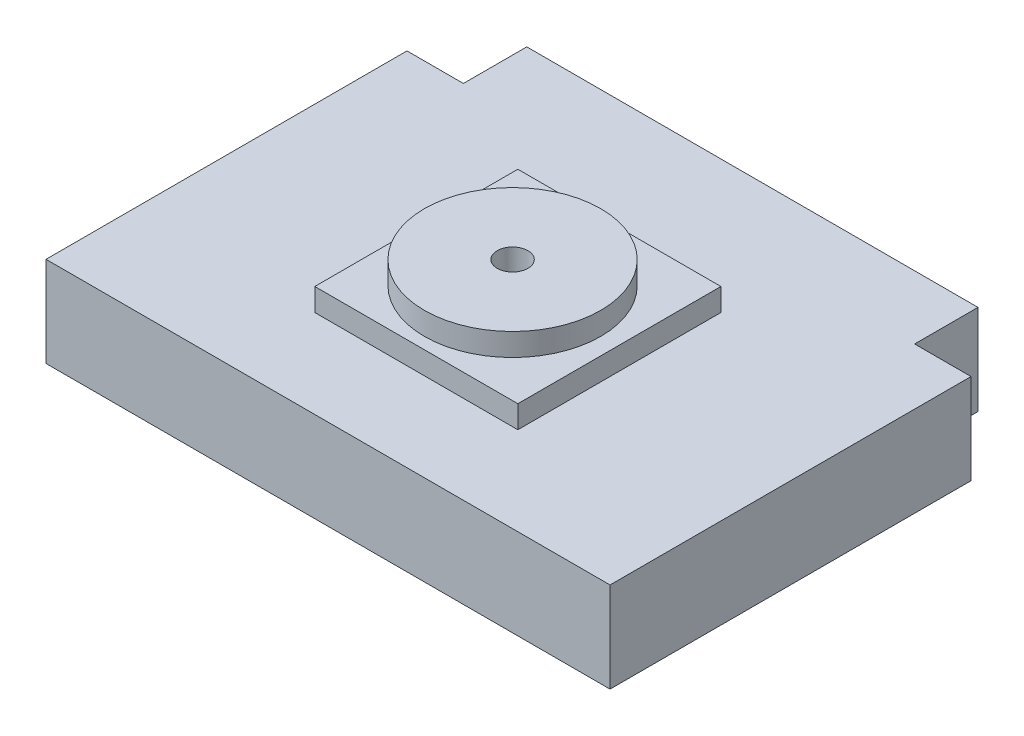
ISO-10303-21;
HEADER;
FILE_DESCRIPTION(('STEP AP214'),'2;1');
FILE_NAME('part.step','',(''),(''),'','','');
FILE_SCHEMA(('AUTOMOTIVE_DESIGN { 1 0 10303 214 1 1 1 1 }'));
ENDSEC;
DATA;
#1=APPLICATION_CONTEXT('core data for automotive mechanical design processes');
#2=APPLICATION_PROTOCOL_DEFINITION('international standard','automotive_design',2000,#1);
#3=PRODUCT_CONTEXT('',#1,'mechanical');
#4=PRODUCT('Part','Part','',(#3));
#5=PRODUCT_RELATED_PRODUCT_CATEGORY('part','',(#4));
#6=PRODUCT_DEFINITION_FORMATION('','',#4);
#7=PRODUCT_DEFINITION_CONTEXT('part definition',#1,'design');
#8=PRODUCT_DEFINITION('design','',#6,#7);
#9=PRODUCT_DEFINITION_SHAPE('','',#8);
#10=(LENGTH_UNIT() NAMED_UNIT(*) SI_UNIT(.MILLI.,.METRE.));
#11=(NAMED_UNIT(*) PLANE_ANGLE_UNIT() SI_UNIT($,.RADIAN.));
#12=(NAMED_UNIT(*) SI_UNIT($,.STERADIAN.) SOLID_ANGLE_UNIT());
#13=UNCERTAINTY_MEASURE_WITH_UNIT(LENGTH_MEASURE(1.E-05),#10,'distance_accuracy_value','');
#14=(GEOMETRIC_REPRESENTATION_CONTEXT(3) GLOBAL_UNCERTAINTY_ASSIGNED_CONTEXT((#13)) GLOBAL_UNIT_ASSIGNED_CONTEXT((#10,
#11,#12)) REPRESENTATION_CONTEXT('',''));
#15=CARTESIAN_POINT('',(0.,0.,0.));
#16=DIRECTION('',(0.,0.,1.));
#17=DIRECTION('',(1.,0.,0.));
#18=AXIS2_PLACEMENT_3D('',#15,#16,#17);
#19=CARTESIAN_POINT('',(0.,6.35,0.));
#20=DIRECTION('',(0.,1.,0.));
#21=DIRECTION('',(0.,0.,1.));
#22=AXIS2_PLACEMENT_3D('',#19,#20,#21);
#23=PLANE('',#22);
#24=DIRECTION('',(0.,0.,1.));
#25=VECTOR('',#24,1.);
#26=CARTESIAN_POINT('',(-12.5317262962186,6.35,-1.56069473231923));
#27=LINE('',#26,#25);
#28=CARTESIAN_POINT('',(-12.5317262962186,6.35,-1.56069473231923));
#29=VERTEX_POINT('',#28);
#30=CARTESIAN_POINT('',(-12.5317262962186,6.35,9.86930526768077));
#31=VERTEX_POINT('',#30);
#32=EDGE_CURVE('E129',#29,#31,#27,.T.);
#33=ORIENTED_EDGE('',*,*,#32,.T.);
#34=DIRECTION('',(1.,0.,0.));
#35=VECTOR('',#34,1.);
#36=CARTESIAN_POINT('',(-12.5317262962186,6.35,9.86930526768077));
#37=LINE('',#36,#35);
#38=CARTESIAN_POINT('',(-1.10172629621863,6.35,9.86930526768077));
#39=VERTEX_POINT('',#38);
#40=EDGE_CURVE('E118',#31,#39,#37,.T.);
#41=ORIENTED_EDGE('',*,*,#40,.T.);
#42=DIRECTION('',(0.,0.,-1.));
#43=VECTOR('',#42,1.);
#44=CARTESIAN_POINT('',(-1.10172629621863,6.35,-1.56069473231923));
#45=LINE('',#44,#43);
#46=CARTESIAN_POINT('',(-1.10172629621863,6.35,-1.56069473231923));
#47=VERTEX_POINT('',#46);
#48=EDGE_CURVE('E128',#39,#47,#45,.T.);
#49=ORIENTED_EDGE('',*,*,#48,.T.);
#50=DIRECTION('',(-1.,0.,0.));
#51=VECTOR('',#50,1.);
#52=CARTESIAN_POINT('',(-12.5317262962186,6.35,-1.56069473231923));
#53=LINE('',#52,#51);
#54=EDGE_CURVE('E134',#47,#29,#53,.T.);
#55=ORIENTED_EDGE('',*,*,#54,.T.);
#56=EDGE_LOOP('',(#33,#41,#49,#55));
#57=FACE_BOUND('',#56,.T.);
#58=CARTESIAN_POINT('',(-7.00918105356774,6.35,4.25869244648158));
#59=DIRECTION('',(0.,1.,0.));
#60=DIRECTION('',(0.,0.,1.));
#61=AXIS2_PLACEMENT_3D('',#58,#59,#60);
#62=CIRCLE('',#61,4.96168879368561);
#63=CARTESIAN_POINT('',(-7.00918105356774,6.35,9.22038124016719));
#64=VERTEX_POINT('',#63);
#65=EDGE_CURVE('E292',#64,#64,#62,.T.);
#66=ORIENTED_EDGE('',*,*,#65,.F.);
#67=EDGE_LOOP('',(#66));
#68=FACE_BOUND('',#67,.T.);
#69=ADVANCED_FACE('F32',(#57,#68),#23,.T.);
#70=CARTESIAN_POINT('',(0.,5.08,0.));
#71=DIRECTION('',(0.,-1.,0.));
#72=DIRECTION('',(0.,0.,-1.));
#73=AXIS2_PLACEMENT_3D('',#70,#71,#72);
#74=PLANE('',#73);
#75=DIRECTION('',(0.,0.,1.));
#76=VECTOR('',#75,1.);
#77=CARTESIAN_POINT('',(-19.5167262962186,5.08,-9.04893742621016));
#78=LINE('',#77,#76);
#79=CARTESIAN_POINT('',(-19.5167262962186,5.08,-9.04893742621016));
#80=VERTEX_POINT('',#79);
#81=CARTESIAN_POINT('',(-19.5167262962186,5.08,-5.48034238488784));
#82=VERTEX_POINT('',#81);
#83=EDGE_CURVE('E151',#80,#82,#78,.T.);
#84=ORIENTED_EDGE('',*,*,#83,.T.);
#85=DIRECTION('',(-1.,0.,0.));
#86=VECTOR('',#85,1.);
#87=CARTESIAN_POINT('',(-19.5167262962186,5.08,-5.48034238488784));
#88=LINE('',#87,#86);
#89=CARTESIAN_POINT('',(-22.6917262962186,5.08,-5.48034238488784));
#90=VERTEX_POINT('',#89);
#91=EDGE_CURVE('E154',#82,#90,#88,.T.);
#92=ORIENTED_EDGE('',*,*,#91,.T.);
#93=DIRECTION('',(0.,0.,1.));
#94=VECTOR('',#93,1.);
#95=CARTESIAN_POINT('',(-22.6917262962186,5.08,-5.48034238488784));
#96=LINE('',#95,#94);
#97=CARTESIAN_POINT('',(-22.6917262962186,5.08,14.8396576151122));
#98=VERTEX_POINT('',#97);
#99=EDGE_CURVE('E157',#90,#98,#96,.T.);
#100=ORIENTED_EDGE('',*,*,#99,.T.);
#101=DIRECTION('',(1.,0.,0.));
#102=VECTOR('',#101,1.);
#103=CARTESIAN_POINT('',(-22.6917262962186,5.08,14.8396576151122));
#104=LINE('',#103,#102);
#105=CARTESIAN_POINT('',(9.05827370378137,5.08,14.8396576151122));
#106=VERTEX_POINT('',#105);
#107=EDGE_CURVE('E159',#98,#106,#104,.T.);
#108=ORIENTED_EDGE('',*,*,#107,.T.);
#109=DIRECTION('',(0.,0.,-1.));
#110=VECTOR('',#109,1.);
#111=CARTESIAN_POINT('',(9.05827370378137,5.08,14.8396576151122));
#112=LINE('',#111,#110);
#113=CARTESIAN_POINT('',(9.05827370378137,5.08,-5.48034238488784));
#114=VERTEX_POINT('',#113);
#115=EDGE_CURVE('E161',#106,#114,#112,.T.);
#116=ORIENTED_EDGE('',*,*,#115,.T.);
#117=DIRECTION('',(-1.,0.,0.));
#118=VECTOR('',#117,1.);
#119=CARTESIAN_POINT('',(9.05827370378137,5.08,-5.48034238488784));
#120=LINE('',#119,#118);
#121=CARTESIAN_POINT('',(5.88327370378137,5.08,-5.48034238488784));
#122=VERTEX_POINT('',#121);
#123=EDGE_CURVE('E163',#114,#122,#120,.T.);
#124=ORIENTED_EDGE('',*,*,#123,.T.);
#125=DIRECTION('',(0.,0.,-1.));
#126=VECTOR('',#125,1.);
#127=CARTESIAN_POINT('',(5.88327370378137,5.08,-5.48034238488784));
#128=LINE('',#127,#126);
#129=CARTESIAN_POINT('',(5.88327370378137,5.08,-9.04893742621015));
#130=VERTEX_POINT('',#129);
#131=EDGE_CURVE('E165',#122,#130,#128,.T.);
#132=ORIENTED_EDGE('',*,*,#131,.T.);
#133=DIRECTION('',(-1.,0.,0.));
#134=VECTOR('',#133,1.);
#135=CARTESIAN_POINT('',(-19.5167262962186,5.08,-9.04893742621016));
#136=LINE('',#135,#134);
#137=EDGE_CURVE('E167',#130,#80,#136,.T.);
#138=ORIENTED_EDGE('',*,*,#137,.T.);
#139=EDGE_LOOP('',(#84,#92,#100,#108,#116,#124,#132,#138));
#140=FACE_BOUND('',#139,.T.);
#141=DIRECTION('',(0.,0.,1.));
#142=VECTOR('',#141,1.);
#143=CARTESIAN_POINT('',(-12.5317262962186,5.08,-1.56069473231923));
#144=LINE('',#143,#142);
#145=CARTESIAN_POINT('',(-12.5317262962186,5.08,-1.56069473231923));
#146=VERTEX_POINT('',#145);
#147=CARTESIAN_POINT('',(-12.5317262962186,5.08,9.86930526768077));
#148=VERTEX_POINT('',#147);
#149=EDGE_CURVE('E141',#146,#148,#144,.T.);
#150=ORIENTED_EDGE('',*,*,#149,.F.);
#151=DIRECTION('',(-1.,0.,0.));
#152=VECTOR('',#151,1.);
#153=CARTESIAN_POINT('',(-12.5317262962186,5.08,-1.56069473231923));
#154=LINE('',#153,#152);
#155=CARTESIAN_POINT('',(-1.10172629621863,5.08,-1.56069473231923));
#156=VERTEX_POINT('',#155);
#157=EDGE_CURVE('E138',#156,#146,#154,.T.);
#158=ORIENTED_EDGE('',*,*,#157,.F.);
#159=DIRECTION('',(0.,0.,-1.));
#160=VECTOR('',#159,1.);
#161=CARTESIAN_POINT('',(-1.10172629621863,5.08,-1.56069473231923));
#162=LINE('',#161,#160);
#163=CARTESIAN_POINT('',(-1.10172629621863,5.08,9.86930526768077));
#164=VERTEX_POINT('',#163);
#165=EDGE_CURVE('E52',#164,#156,#162,.T.);
#166=ORIENTED_EDGE('',*,*,#165,.F.);
#167=DIRECTION('',(1.,0.,0.));
#168=VECTOR('',#167,1.);
#169=CARTESIAN_POINT('',(-12.5317262962186,5.08,9.86930526768077));
#170=LINE('',#169,#168);
#171=EDGE_CURVE('E47',#148,#164,#170,.T.);
#172=ORIENTED_EDGE('',*,*,#171,.F.);
#173=EDGE_LOOP('',(#150,#158,#166,#172));
#174=FACE_BOUND('',#173,.T.);
#175=ADVANCED_FACE('F227',(#140,#174),#74,.F.);
#176=CARTESIAN_POINT('',(-19.5167262962186,5.08,-9.04893742621016));
#177=DIRECTION('',(1.,0.,0.));
#178=DIRECTION('',(0.,0.,-1.));
#179=AXIS2_PLACEMENT_3D('',#176,#177,#178);
#180=PLANE('',#179);
#181=DIRECTION('',(0.,0.,1.));
#182=VECTOR('',#181,1.);
#183=CARTESIAN_POINT('',(-19.5167262962186,0.,-9.04893742621016));
#184=LINE('',#183,#182);
#185=CARTESIAN_POINT('',(-19.5167262962186,0.,-9.04893742621016));
#186=VERTEX_POINT('',#185);
#187=CARTESIAN_POINT('',(-19.5167262962186,0.,-5.48034238488784));
#188=VERTEX_POINT('',#187);
#189=EDGE_CURVE('E142',#186,#188,#184,.T.);
#190=ORIENTED_EDGE('',*,*,#189,.T.);
#191=DIRECTION('',(0.,-1.,0.));
#192=VECTOR('',#191,1.);
#193=CARTESIAN_POINT('',(-19.5167262962186,5.08,-5.48034238488784));
#194=LINE('',#193,#192);
#195=EDGE_CURVE('E40',#82,#188,#194,.T.);
#196=ORIENTED_EDGE('',*,*,#195,.F.);
#197=ORIENTED_EDGE('',*,*,#83,.F.);
#198=DIRECTION('',(0.,-1.,0.));
#199=VECTOR('',#198,1.);
#200=CARTESIAN_POINT('',(-19.5167262962186,5.08,-9.04893742621016));
#201=LINE('',#200,#199);
#202=EDGE_CURVE('E168',#80,#186,#201,.T.);
#203=ORIENTED_EDGE('',*,*,#202,.T.);
#204=EDGE_LOOP('',(#190,#196,#197,#203));
#205=FACE_BOUND('',#204,.T.);
#206=ADVANCED_FACE('F34',(#205),#180,.F.);
#207=CARTESIAN_POINT('',(-19.5167262962186,5.08,-5.48034238488784));
#208=DIRECTION('',(0.,0.,1.));
#209=DIRECTION('',(1.,0.,0.));
#210=AXIS2_PLACEMENT_3D('',#207,#208,#209);
#211=PLANE('',#210);
#212=DIRECTION('',(-1.,0.,0.));
#213=VECTOR('',#212,1.);
#214=CARTESIAN_POINT('',(-19.5167262962186,0.,-5.48034238488784));
#215=LINE('',#214,#213);
#216=CARTESIAN_POINT('',(-22.6917262962186,0.,-5.48034238488784));
#217=VERTEX_POINT('',#216);
#218=EDGE_CURVE('E145',#188,#217,#215,.T.);
#219=ORIENTED_EDGE('',*,*,#218,.T.);
#220=DIRECTION('',(0.,-1.,0.));
#221=VECTOR('',#220,1.);
#222=CARTESIAN_POINT('',(-22.6917262962186,5.08,-5.48034238488784));
#223=LINE('',#222,#221);
#224=EDGE_CURVE('E199',#90,#217,#223,.T.);
#225=ORIENTED_EDGE('',*,*,#224,.F.);
#226=ORIENTED_EDGE('',*,*,#91,.F.);
#227=ORIENTED_EDGE('',*,*,#195,.T.);
#228=EDGE_LOOP('',(#219,#225,#226,#227));
#229=FACE_BOUND('',#228,.T.);
#230=ADVANCED_FACE('F204',(#229),#211,.F.);
#231=CARTESIAN_POINT('',(-22.6917262962186,5.08,-5.48034238488784));
#232=DIRECTION('',(1.,0.,0.));
#233=DIRECTION('',(0.,0.,-1.));
#234=AXIS2_PLACEMENT_3D('',#231,#232,#233);
#235=PLANE('',#234);
#236=DIRECTION('',(0.,0.,1.));
#237=VECTOR('',#236,1.);
#238=CARTESIAN_POINT('',(-22.6917262962186,0.,-5.48034238488784));
#239=LINE('',#238,#237);
#240=CARTESIAN_POINT('',(-22.6917262962186,0.,14.8396576151122));
#241=VERTEX_POINT('',#240);
#242=EDGE_CURVE('E171',#217,#241,#239,.T.);
#243=ORIENTED_EDGE('',*,*,#242,.T.);
#244=DIRECTION('',(0.,-1.,0.));
#245=VECTOR('',#244,1.);
#246=CARTESIAN_POINT('',(-22.6917262962186,5.08,14.8396576151122));
#247=LINE('',#246,#245);
#248=EDGE_CURVE('E196',#98,#241,#247,.T.);
#249=ORIENTED_EDGE('',*,*,#248,.F.);
#250=ORIENTED_EDGE('',*,*,#99,.F.);
#251=ORIENTED_EDGE('',*,*,#224,.T.);
#252=EDGE_LOOP('',(#243,#249,#250,#251));
#253=FACE_BOUND('',#252,.T.);
#254=ADVANCED_FACE('F219',(#253),#235,.F.);
#255=CARTESIAN_POINT('',(-22.6917262962186,5.08,14.8396576151122));
#256=DIRECTION('',(0.,0.,-1.));
#257=DIRECTION('',(-1.,0.,0.));
#258=AXIS2_PLACEMENT_3D('',#255,#256,#257);
#259=PLANE('',#258);
#260=DIRECTION('',(1.,0.,0.));
#261=VECTOR('',#260,1.);
#262=CARTESIAN_POINT('',(-22.6917262962186,0.,14.8396576151122));
#263=LINE('',#262,#261);
#264=CARTESIAN_POINT('',(9.05827370378137,0.,14.8396576151122));
#265=VERTEX_POINT('',#264);
#266=EDGE_CURVE('E173',#241,#265,#263,.T.);
#267=ORIENTED_EDGE('',*,*,#266,.T.);
#268=DIRECTION('',(0.,-1.,0.));
#269=VECTOR('',#268,1.);
#270=CARTESIAN_POINT('',(9.05827370378137,5.08,14.8396576151122));
#271=LINE('',#270,#269);
#272=EDGE_CURVE('E193',#106,#265,#271,.T.);
#273=ORIENTED_EDGE('',*,*,#272,.F.);
#274=ORIENTED_EDGE('',*,*,#107,.F.);
#275=ORIENTED_EDGE('',*,*,#248,.T.);
#276=EDGE_LOOP('',(#267,#273,#274,#275));
#277=FACE_BOUND('',#276,.T.);
#278=ADVANCED_FACE('F223',(#277),#259,.F.);
#279=CARTESIAN_POINT('',(9.05827370378137,5.08,14.8396576151122));
#280=DIRECTION('',(-1.,0.,0.));
#281=DIRECTION('',(0.,0.,1.));
#282=AXIS2_PLACEMENT_3D('',#279,#280,#281);
#283=PLANE('',#282);
#284=DIRECTION('',(0.,0.,-1.));
#285=VECTOR('',#284,1.);
#286=CARTESIAN_POINT('',(9.05827370378137,0.,14.8396576151122));
#287=LINE('',#286,#285);
#288=CARTESIAN_POINT('',(9.05827370378137,0.,-5.48034238488784));
#289=VERTEX_POINT('',#288);
#290=EDGE_CURVE('E175',#265,#289,#287,.T.);
#291=ORIENTED_EDGE('',*,*,#290,.T.);
#292=DIRECTION('',(0.,-1.,0.));
#293=VECTOR('',#292,1.);
#294=CARTESIAN_POINT('',(9.05827370378137,5.08,-5.48034238488784));
#295=LINE('',#294,#293);
#296=EDGE_CURVE('E190',#114,#289,#295,.T.);
#297=ORIENTED_EDGE('',*,*,#296,.F.);
#298=ORIENTED_EDGE('',*,*,#115,.F.);
#299=ORIENTED_EDGE('',*,*,#272,.T.);
#300=EDGE_LOOP('',(#291,#297,#298,#299));
#301=FACE_BOUND('',#300,.T.);
#302=ADVANCED_FACE('F242',(#301),#283,.F.);
#303=CARTESIAN_POINT('',(9.05827370378137,5.08,-5.48034238488784));
#304=DIRECTION('',(0.,0.,1.));
#305=DIRECTION('',(1.,0.,0.));
#306=AXIS2_PLACEMENT_3D('',#303,#304,#305);
#307=PLANE('',#306);
#308=DIRECTION('',(-1.,0.,0.));
#309=VECTOR('',#308,1.);
#310=CARTESIAN_POINT('',(9.05827370378137,0.,-5.48034238488784));
#311=LINE('',#310,#309);
#312=CARTESIAN_POINT('',(5.88327370378137,0.,-5.48034238488784));
#313=VERTEX_POINT('',#312);
#314=EDGE_CURVE('E177',#289,#313,#311,.T.);
#315=ORIENTED_EDGE('',*,*,#314,.T.);
#316=DIRECTION('',(0.,-1.,0.));
#317=VECTOR('',#316,1.);
#318=CARTESIAN_POINT('',(5.88327370378137,5.08,-5.48034238488784));
#319=LINE('',#318,#317);
#320=EDGE_CURVE('E187',#122,#313,#319,.T.);
#321=ORIENTED_EDGE('',*,*,#320,.F.);
#322=ORIENTED_EDGE('',*,*,#123,.F.);
#323=ORIENTED_EDGE('',*,*,#296,.T.);
#324=EDGE_LOOP('',(#315,#321,#322,#323));
#325=FACE_BOUND('',#324,.T.);
#326=ADVANCED_FACE('F239',(#325),#307,.F.);
#327=CARTESIAN_POINT('',(5.88327370378137,5.08,-5.48034238488784));
#328=DIRECTION('',(-1.,0.,0.));
#329=DIRECTION('',(0.,0.,1.));
#330=AXIS2_PLACEMENT_3D('',#327,#328,#329);
#331=PLANE('',#330);
#332=DIRECTION('',(0.,0.,-1.));
#333=VECTOR('',#332,1.);
#334=CARTESIAN_POINT('',(5.88327370378137,0.,-5.48034238488784));
#335=LINE('',#334,#333);
#336=CARTESIAN_POINT('',(5.88327370378137,0.,-9.04893742621015));
#337=VERTEX_POINT('',#336);
#338=EDGE_CURVE('E179',#313,#337,#335,.T.);
#339=ORIENTED_EDGE('',*,*,#338,.T.);
#340=DIRECTION('',(0.,-1.,0.));
#341=VECTOR('',#340,1.);
#342=CARTESIAN_POINT('',(5.88327370378137,5.08,-9.04893742621015));
#343=LINE('',#342,#341);
#344=EDGE_CURVE('E184',#130,#337,#343,.T.);
#345=ORIENTED_EDGE('',*,*,#344,.F.);
#346=ORIENTED_EDGE('',*,*,#131,.F.);
#347=ORIENTED_EDGE('',*,*,#320,.T.);
#348=EDGE_LOOP('',(#339,#345,#346,#347));
#349=FACE_BOUND('',#348,.T.);
#350=ADVANCED_FACE('F235',(#349),#331,.F.);
#351=CARTESIAN_POINT('',(-19.5167262962186,5.08,-9.04893742621016));
#352=DIRECTION('',(0.,0.,1.));
#353=DIRECTION('',(1.,0.,0.));
#354=AXIS2_PLACEMENT_3D('',#351,#352,#353);
#355=PLANE('',#354);
#356=DIRECTION('',(-1.,0.,0.));
#357=VECTOR('',#356,1.);
#358=CARTESIAN_POINT('',(-19.5167262962186,0.,-9.04893742621016));
#359=LINE('',#358,#357);
#360=EDGE_CURVE('E155',#337,#186,#359,.T.);
#361=ORIENTED_EDGE('',*,*,#360,.T.);
#362=ORIENTED_EDGE('',*,*,#202,.F.);
#363=ORIENTED_EDGE('',*,*,#137,.F.);
#364=ORIENTED_EDGE('',*,*,#344,.T.);
#365=EDGE_LOOP('',(#361,#362,#363,#364));
#366=FACE_BOUND('',#365,.T.);
#367=ADVANCED_FACE('F233',(#366),#355,.F.);
#368=CARTESIAN_POINT('',(0.,0.,0.));
#369=DIRECTION('',(0.,-1.,0.));
#370=DIRECTION('',(0.,0.,-1.));
#371=AXIS2_PLACEMENT_3D('',#368,#369,#370);
#372=PLANE('',#371);
#373=ORIENTED_EDGE('',*,*,#189,.F.);
#374=ORIENTED_EDGE('',*,*,#360,.F.);
#375=ORIENTED_EDGE('',*,*,#338,.F.);
#376=ORIENTED_EDGE('',*,*,#314,.F.);
#377=ORIENTED_EDGE('',*,*,#290,.F.);
#378=ORIENTED_EDGE('',*,*,#266,.F.);
#379=ORIENTED_EDGE('',*,*,#242,.F.);
#380=ORIENTED_EDGE('',*,*,#218,.F.);
#381=EDGE_LOOP('',(#373,#374,#375,#376,#377,#378,#379,#380));
#382=FACE_BOUND('',#381,.T.);
#383=ADVANCED_FACE('F212',(#382),#372,.T.);
#384=CARTESIAN_POINT('',(-12.5317262962186,6.35,-1.56069473231923));
#385=DIRECTION('',(1.,0.,0.));
#386=DIRECTION('',(0.,0.,-1.));
#387=AXIS2_PLACEMENT_3D('',#384,#385,#386);
#388=PLANE('',#387);
#389=ORIENTED_EDGE('',*,*,#149,.T.);
#390=DIRECTION('',(0.,-1.,0.));
#391=VECTOR('',#390,1.);
#392=CARTESIAN_POINT('',(-12.5317262962186,6.35,9.86930526768077));
#393=LINE('',#392,#391);
#394=EDGE_CURVE('E122',#31,#148,#393,.T.);
#395=ORIENTED_EDGE('',*,*,#394,.F.);
#396=ORIENTED_EDGE('',*,*,#32,.F.);
#397=DIRECTION('',(0.,-1.,0.));
#398=VECTOR('',#397,1.);
#399=CARTESIAN_POINT('',(-12.5317262962186,6.35,-1.56069473231923));
#400=LINE('',#399,#398);
#401=EDGE_CURVE('E300',#29,#146,#400,.T.);
#402=ORIENTED_EDGE('',*,*,#401,.T.);
#403=EDGE_LOOP('',(#389,#395,#396,#402));
#404=FACE_BOUND('',#403,.T.);
#405=ADVANCED_FACE('F140',(#404),#388,.F.);
#406=CARTESIAN_POINT('',(-12.5317262962186,6.35,9.86930526768077));
#407=DIRECTION('',(0.,0.,-1.));
#408=DIRECTION('',(-1.,0.,0.));
#409=AXIS2_PLACEMENT_3D('',#406,#407,#408);
#410=PLANE('',#409);
#411=ORIENTED_EDGE('',*,*,#171,.T.);
#412=DIRECTION('',(0.,-1.,0.));
#413=VECTOR('',#412,1.);
#414=CARTESIAN_POINT('',(-1.10172629621863,6.35,9.86930526768077));
#415=LINE('',#414,#413);
#416=EDGE_CURVE('E125',#39,#164,#415,.T.);
#417=ORIENTED_EDGE('',*,*,#416,.F.);
#418=ORIENTED_EDGE('',*,*,#40,.F.);
#419=ORIENTED_EDGE('',*,*,#394,.T.);
#420=EDGE_LOOP('',(#411,#417,#418,#419));
#421=FACE_BOUND('',#420,.T.);
#422=ADVANCED_FACE('F120',(#421),#410,.F.);
#423=CARTESIAN_POINT('',(-1.10172629621863,6.35,-1.56069473231923));
#424=DIRECTION('',(-1.,0.,0.));
#425=DIRECTION('',(0.,0.,1.));
#426=AXIS2_PLACEMENT_3D('',#423,#424,#425);
#427=PLANE('',#426);
#428=ORIENTED_EDGE('',*,*,#165,.T.);
#429=DIRECTION('',(0.,-1.,0.));
#430=VECTOR('',#429,1.);
#431=CARTESIAN_POINT('',(-1.10172629621863,6.35,-1.56069473231923));
#432=LINE('',#431,#430);
#433=EDGE_CURVE('E147',#47,#156,#432,.T.);
#434=ORIENTED_EDGE('',*,*,#433,.F.);
#435=ORIENTED_EDGE('',*,*,#48,.F.);
#436=ORIENTED_EDGE('',*,*,#416,.T.);
#437=EDGE_LOOP('',(#428,#434,#435,#436));
#438=FACE_BOUND('',#437,.T.);
#439=ADVANCED_FACE('F284',(#438),#427,.F.);
#440=CARTESIAN_POINT('',(-12.5317262962186,6.35,-1.56069473231923));
#441=DIRECTION('',(0.,0.,1.));
#442=DIRECTION('',(1.,0.,0.));
#443=AXIS2_PLACEMENT_3D('',#440,#441,#442);
#444=PLANE('',#443);
#445=ORIENTED_EDGE('',*,*,#157,.T.);
#446=ORIENTED_EDGE('',*,*,#401,.F.);
#447=ORIENTED_EDGE('',*,*,#54,.F.);
#448=ORIENTED_EDGE('',*,*,#433,.T.);
#449=EDGE_LOOP('',(#445,#446,#447,#448));
#450=FACE_BOUND('',#449,.T.);
#451=ADVANCED_FACE('F279',(#450),#444,.F.);
#452=CARTESIAN_POINT('',(-7.00918105356774,7.62,4.25869244648158));
#453=DIRECTION('',(0.,1.,0.));
#454=DIRECTION('',(0.,0.,1.));
#455=AXIS2_PLACEMENT_3D('',#452,#453,#454);
#456=PLANE('',#455);
#457=CARTESIAN_POINT('',(-7.00918105356774,7.62,4.25869244648158));
#458=DIRECTION('',(0.,1.,0.));
#459=DIRECTION('',(0.,0.,1.));
#460=AXIS2_PLACEMENT_3D('',#457,#458,#459);
#461=CIRCLE('',#460,4.96168879368561);
#462=CARTESIAN_POINT('',(-7.00918105356774,7.62,9.22038124016719));
#463=VERTEX_POINT('',#462);
#464=EDGE_CURVE('E289',#463,#463,#461,.T.);
#465=ORIENTED_EDGE('',*,*,#464,.T.);
#466=EDGE_LOOP('',(#465));
#467=FACE_BOUND('',#466,.T.);
#468=CARTESIAN_POINT('',(-7.00918105356774,7.62,4.25869244648158));
#469=DIRECTION('',(0.,1.,0.));
#470=DIRECTION('',(0.,0.,1.));
#471=AXIS2_PLACEMENT_3D('',#468,#469,#470);
#472=CIRCLE('',#471,0.865135847368851);
#473=CARTESIAN_POINT('',(-7.00918105356774,7.62,5.12382829385043));
#474=VERTEX_POINT('',#473);
#475=EDGE_CURVE('E291',#474,#474,#472,.T.);
#476=ORIENTED_EDGE('',*,*,#475,.F.);
#477=EDGE_LOOP('',(#476));
#478=FACE_BOUND('',#477,.T.);
#479=ADVANCED_FACE('F274',(#467,#478),#456,.T.);
#480=CARTESIAN_POINT('',(-7.00918105356774,7.62,4.25869244648158));
#481=DIRECTION('',(0.,-1.,0.));
#482=DIRECTION('',(0.,0.,-1.));
#483=AXIS2_PLACEMENT_3D('',#480,#481,#482);
#484=CYLINDRICAL_SURFACE('',#483,4.96168879368561);
#485=ORIENTED_EDGE('',*,*,#464,.F.);
#486=EDGE_LOOP('',(#485));
#487=FACE_BOUND('',#486,.T.);
#488=ORIENTED_EDGE('',*,*,#65,.T.);
#489=EDGE_LOOP('',(#488));
#490=FACE_BOUND('',#489,.T.);
#491=ADVANCED_FACE('F266',(#487,#490),#484,.T.);
#492=CARTESIAN_POINT('',(-7.00918105356774,7.62,4.25869244648158));
#493=DIRECTION('',(0.,-1.,0.));
#494=DIRECTION('',(0.,0.,-1.));
#495=AXIS2_PLACEMENT_3D('',#492,#493,#494);
#496=CYLINDRICAL_SURFACE('',#495,0.865135847368851);
#497=ORIENTED_EDGE('',*,*,#475,.T.);
#498=EDGE_LOOP('',(#497));
#499=FACE_BOUND('',#498,.T.);
#500=CARTESIAN_POINT('',(-7.00918105356774,6.35,4.25869244648158));
#501=DIRECTION('',(0.,1.,0.));
#502=DIRECTION('',(0.,0.,1.));
#503=AXIS2_PLACEMENT_3D('',#500,#501,#502);
#504=CIRCLE('',#503,0.865135847368851);
#505=CARTESIAN_POINT('',(-7.00918105356774,6.35,5.12382829385043));
#506=VERTEX_POINT('',#505);
#507=EDGE_CURVE('E11',#506,#506,#504,.F.);
#508=ORIENTED_EDGE('',*,*,#507,.T.);
#509=EDGE_LOOP('',(#508));
#510=FACE_BOUND('',#509,.T.);
#511=ADVANCED_FACE('F261',(#499,#510),#496,.F.);
#512=ORIENTED_EDGE('',*,*,#507,.F.);
#513=EDGE_LOOP('',(#512));
#514=FACE_BOUND('',#513,.T.);
#515=ADVANCED_FACE('F253',(#514),#23,.T.);
#516=CLOSED_SHELL('',(#69,#175,#206,#230,#254,#278,#302,#326,#350,#367,#383,#405,#422,#439,#451,
#479,#491,#511,#515));
#517=MANIFOLD_SOLID_BREP('B2',#516);
#518=ADVANCED_BREP_SHAPE_REPRESENTATION('',(#18,#517),#14);
#519=SHAPE_DEFINITION_REPRESENTATION(#9,#518);
ENDSEC;
END-ISO-10303-21;
